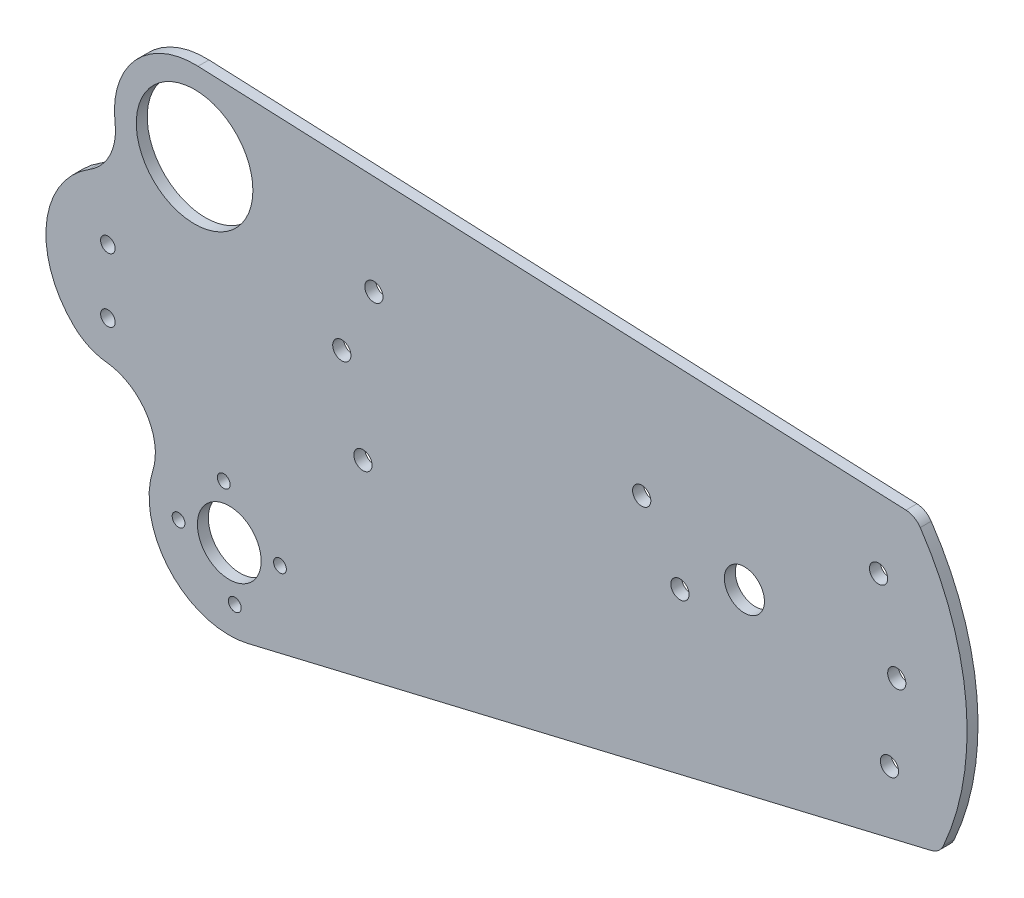
ISO-10303-21;
HEADER;
FILE_DESCRIPTION(('STEP AP214'),'2;1');
FILE_NAME('part.step','',(''),(''),'','','');
FILE_SCHEMA(('AUTOMOTIVE_DESIGN { 1 0 10303 214 1 1 1 1 }'));
ENDSEC;
DATA;
#1=APPLICATION_CONTEXT('core data for automotive mechanical design processes');
#2=APPLICATION_PROTOCOL_DEFINITION('international standard','automotive_design',2000,#1);
#3=PRODUCT_CONTEXT('',#1,'mechanical');
#4=PRODUCT('Part','Part','',(#3));
#5=PRODUCT_RELATED_PRODUCT_CATEGORY('part','',(#4));
#6=PRODUCT_DEFINITION_FORMATION('','',#4);
#7=PRODUCT_DEFINITION_CONTEXT('part definition',#1,'design');
#8=PRODUCT_DEFINITION('design','',#6,#7);
#9=PRODUCT_DEFINITION_SHAPE('','',#8);
#10=(LENGTH_UNIT() NAMED_UNIT(*) SI_UNIT(.MILLI.,.METRE.));
#11=(NAMED_UNIT(*) PLANE_ANGLE_UNIT() SI_UNIT($,.RADIAN.));
#12=(NAMED_UNIT(*) SI_UNIT($,.STERADIAN.) SOLID_ANGLE_UNIT());
#13=UNCERTAINTY_MEASURE_WITH_UNIT(LENGTH_MEASURE(1.E-05),#10,'distance_accuracy_value','');
#14=(GEOMETRIC_REPRESENTATION_CONTEXT(3) GLOBAL_UNCERTAINTY_ASSIGNED_CONTEXT((#13)) GLOBAL_UNIT_ASSIGNED_CONTEXT((#10,
#11,#12)) REPRESENTATION_CONTEXT('',''));
#15=CARTESIAN_POINT('',(0.,0.,0.));
#16=DIRECTION('',(0.,0.,1.));
#17=DIRECTION('',(1.,0.,0.));
#18=AXIS2_PLACEMENT_3D('',#15,#16,#17);
#19=CARTESIAN_POINT('',(1.91215632842237,44.5201547339827,3.));
#20=DIRECTION('',(0.0429107910239942,0.999078907801428,0.));
#21=DIRECTION('',(-0.999078907801428,0.0429107910239942,0.));
#22=AXIS2_PLACEMENT_3D('',#19,#20,#21);
#23=PLANE('',#22);
#24=DIRECTION('',(0.999078907801428,-0.0429107910239942,0.));
#25=VECTOR('',#24,1.);
#26=CARTESIAN_POINT('',(1.91215632842237,44.5201547339827,0.));
#27=LINE('',#26,#25);
#28=CARTESIAN_POINT('',(-113.560266524185,49.4797359716314,0.));
#29=VERTEX_POINT('',#28);
#30=CARTESIAN_POINT('',(80.7215881233943,41.1352618771054,0.));
#31=VERTEX_POINT('',#30);
#32=EDGE_CURVE('E195',#29,#31,#27,.T.);
#33=ORIENTED_EDGE('',*,*,#32,.F.);
#34=DIRECTION('',(0.,0.,-1.));
#35=VECTOR('',#34,1.);
#36=CARTESIAN_POINT('',(-113.560266524185,49.4797359716314,3.));
#37=LINE('',#36,#35);
#38=CARTESIAN_POINT('',(-113.560266524185,49.4797359716314,3.));
#39=VERTEX_POINT('',#38);
#40=EDGE_CURVE('E11',#39,#29,#37,.T.);
#41=ORIENTED_EDGE('',*,*,#40,.F.);
#42=DIRECTION('',(0.999078907801428,-0.0429107910239942,0.));
#43=VECTOR('',#42,1.);
#44=CARTESIAN_POINT('',(1.91215632842237,44.5201547339827,3.));
#45=LINE('',#44,#43);
#46=CARTESIAN_POINT('',(80.7215881233943,41.1352618771054,3.));
#47=VERTEX_POINT('',#46);
#48=EDGE_CURVE('E423',#39,#47,#45,.T.);
#49=ORIENTED_EDGE('',*,*,#48,.T.);
#50=DIRECTION('',(0.,0.,-1.));
#51=VECTOR('',#50,1.);
#52=CARTESIAN_POINT('',(80.7215881233943,41.1352618771054,3.));
#53=LINE('',#52,#51);
#54=EDGE_CURVE('E102',#47,#31,#53,.T.);
#55=ORIENTED_EDGE('',*,*,#54,.T.);
#56=EDGE_LOOP('',(#33,#41,#49,#55));
#57=FACE_BOUND('',#56,.T.);
#58=ADVANCED_FACE('F41',(#57),#23,.T.);
#59=CARTESIAN_POINT('',(-114.504303926713,27.5,3.));
#60=DIRECTION('',(0.,0.,-1.));
#61=DIRECTION('',(-1.,0.,0.));
#62=AXIS2_PLACEMENT_3D('',#59,#60,#61);
#63=CYLINDRICAL_SURFACE('',#62,22.);
#64=CARTESIAN_POINT('',(-114.504303926713,27.5,0.));
#65=DIRECTION('',(0.,0.,1.));
#66=DIRECTION('',(1.,0.,0.));
#67=AXIS2_PLACEMENT_3D('',#64,#65,#66);
#68=CIRCLE('',#67,22.);
#69=CARTESIAN_POINT('',(-136.329525130672,24.732380192604,0.));
#70=VERTEX_POINT('',#69);
#71=EDGE_CURVE('E192',#29,#70,#68,.T.);
#72=ORIENTED_EDGE('',*,*,#71,.T.);
#73=DIRECTION('',(0.,0.,-1.));
#74=VECTOR('',#73,1.);
#75=CARTESIAN_POINT('',(-136.329525130672,24.732380192604,3.));
#76=LINE('',#75,#74);
#77=CARTESIAN_POINT('',(-136.329525130672,24.732380192604,3.));
#78=VERTEX_POINT('',#77);
#79=EDGE_CURVE('E51',#78,#70,#76,.T.);
#80=ORIENTED_EDGE('',*,*,#79,.F.);
#81=CARTESIAN_POINT('',(-114.504303926713,27.5,3.));
#82=DIRECTION('',(0.,0.,1.));
#83=DIRECTION('',(1.,0.,0.));
#84=AXIS2_PLACEMENT_3D('',#81,#82,#83);
#85=CIRCLE('',#84,22.);
#86=EDGE_CURVE('E426',#39,#78,#85,.T.);
#87=ORIENTED_EDGE('',*,*,#86,.F.);
#88=ORIENTED_EDGE('',*,*,#40,.T.);
#89=EDGE_LOOP('',(#72,#80,#87,#88));
#90=FACE_BOUND('',#89,.T.);
#91=ADVANCED_FACE('F193',(#90),#63,.T.);
#92=CARTESIAN_POINT('',(-151.210357769734,22.8453666875613,3.));
#93=DIRECTION('',(0.,0.,-1.));
#94=DIRECTION('',(-1.,0.,0.));
#95=AXIS2_PLACEMENT_3D('',#92,#93,#94);
#96=CYLINDRICAL_SURFACE('',#95,15.);
#97=CARTESIAN_POINT('',(-151.210357769734,22.8453666875613,0.));
#98=DIRECTION('',(0.,0.,1.));
#99=DIRECTION('',(1.,0.,0.));
#100=AXIS2_PLACEMENT_3D('',#97,#98,#99);
#101=CIRCLE('',#100,15.);
#102=CARTESIAN_POINT('',(-143.370984404331,10.0569256082972,0.));
#103=VERTEX_POINT('',#102);
#104=EDGE_CURVE('E187',#103,#70,#101,.T.);
#105=ORIENTED_EDGE('',*,*,#104,.F.);
#106=DIRECTION('',(0.,0.,-1.));
#107=VECTOR('',#106,1.);
#108=CARTESIAN_POINT('',(-143.370984404331,10.0569256082972,3.));
#109=LINE('',#108,#107);
#110=CARTESIAN_POINT('',(-143.370984404331,10.0569256082972,3.));
#111=VERTEX_POINT('',#110);
#112=EDGE_CURVE('E177',#111,#103,#109,.T.);
#113=ORIENTED_EDGE('',*,*,#112,.F.);
#114=CARTESIAN_POINT('',(-151.210357769734,22.8453666875613,3.));
#115=DIRECTION('',(0.,0.,1.));
#116=DIRECTION('',(1.,0.,0.));
#117=AXIS2_PLACEMENT_3D('',#114,#115,#116);
#118=CIRCLE('',#117,15.);
#119=EDGE_CURVE('E189',#111,#78,#118,.T.);
#120=ORIENTED_EDGE('',*,*,#119,.T.);
#121=ORIENTED_EDGE('',*,*,#79,.T.);
#122=EDGE_LOOP('',(#105,#113,#120,#121));
#123=FACE_BOUND('',#122,.T.);
#124=ADVANCED_FACE('F185',(#123),#96,.F.);
#125=CARTESIAN_POINT('',(-130.305362128659,-11.2571428571429,3.));
#126=DIRECTION('',(0.,0.,-1.));
#127=DIRECTION('',(-1.,0.,0.));
#128=AXIS2_PLACEMENT_3D('',#125,#126,#127);
#129=CYLINDRICAL_SURFACE('',#128,25.);
#130=CARTESIAN_POINT('',(-130.305362128659,-11.2571428571429,0.));
#131=DIRECTION('',(0.,0.,1.));
#132=DIRECTION('',(1.,0.,0.));
#133=AXIS2_PLACEMENT_3D('',#130,#131,#132);
#134=CIRCLE('',#133,25.);
#135=CARTESIAN_POINT('',(-147.542861296201,-29.3642857142857,0.));
#136=VERTEX_POINT('',#135);
#137=EDGE_CURVE('E201',#103,#136,#134,.T.);
#138=ORIENTED_EDGE('',*,*,#137,.T.);
#139=DIRECTION('',(0.,0.,-1.));
#140=VECTOR('',#139,1.);
#141=CARTESIAN_POINT('',(-147.542861296201,-29.3642857142857,3.));
#142=LINE('',#141,#140);
#143=CARTESIAN_POINT('',(-147.542861296201,-29.3642857142857,3.));
#144=VERTEX_POINT('',#143);
#145=EDGE_CURVE('E173',#144,#136,#142,.T.);
#146=ORIENTED_EDGE('',*,*,#145,.F.);
#147=CARTESIAN_POINT('',(-130.305362128659,-11.2571428571429,3.));
#148=DIRECTION('',(0.,0.,1.));
#149=DIRECTION('',(1.,0.,0.));
#150=AXIS2_PLACEMENT_3D('',#147,#148,#149);
#151=CIRCLE('',#150,25.);
#152=EDGE_CURVE('E433',#111,#144,#151,.T.);
#153=ORIENTED_EDGE('',*,*,#152,.F.);
#154=ORIENTED_EDGE('',*,*,#112,.T.);
#155=EDGE_LOOP('',(#138,#146,#153,#154));
#156=FACE_BOUND('',#155,.T.);
#157=ADVANCED_FACE('F321',(#156),#129,.T.);
#158=CARTESIAN_POINT('',(-137.200361795676,-18.5,3.));
#159=DIRECTION('',(0.,0.,-1.));
#160=DIRECTION('',(-1.,0.,0.));
#161=AXIS2_PLACEMENT_3D('',#158,#159,#160);
#162=CYLINDRICAL_SURFACE('',#161,15.);
#163=CARTESIAN_POINT('',(-137.200361795676,-18.5,0.));
#164=DIRECTION('',(0.,0.,1.));
#165=DIRECTION('',(1.,0.,0.));
#166=AXIS2_PLACEMENT_3D('',#163,#164,#165);
#167=CIRCLE('',#166,15.);
#168=CARTESIAN_POINT('',(-138.735140925498,-33.4212751808505,0.));
#169=VERTEX_POINT('',#168);
#170=EDGE_CURVE('E205',#136,#169,#167,.T.);
#171=ORIENTED_EDGE('',*,*,#170,.T.);
#172=DIRECTION('',(0.,0.,-1.));
#173=VECTOR('',#172,1.);
#174=CARTESIAN_POINT('',(-138.735140925498,-33.4212751808505,3.));
#175=LINE('',#174,#173);
#176=CARTESIAN_POINT('',(-138.735140925498,-33.4212751808505,3.));
#177=VERTEX_POINT('',#176);
#178=EDGE_CURVE('E170',#177,#169,#175,.T.);
#179=ORIENTED_EDGE('',*,*,#178,.F.);
#180=CARTESIAN_POINT('',(-137.200361795676,-18.5,3.));
#181=DIRECTION('',(0.,0.,1.));
#182=DIRECTION('',(1.,0.,0.));
#183=AXIS2_PLACEMENT_3D('',#180,#181,#182);
#184=CIRCLE('',#183,15.);
#185=EDGE_CURVE('E437',#144,#177,#184,.T.);
#186=ORIENTED_EDGE('',*,*,#185,.F.);
#187=ORIENTED_EDGE('',*,*,#145,.T.);
#188=EDGE_LOOP('',(#171,#179,#186,#187));
#189=FACE_BOUND('',#188,.T.);
#190=ADVANCED_FACE('F324',(#189),#162,.T.);
#191=CARTESIAN_POINT('',(-140.26992005532,-48.3425503617009,3.));
#192=DIRECTION('',(0.,0.,-1.));
#193=DIRECTION('',(-1.,0.,0.));
#194=AXIS2_PLACEMENT_3D('',#191,#192,#193);
#195=CYLINDRICAL_SURFACE('',#194,15.);
#196=CARTESIAN_POINT('',(-140.26992005532,-48.3425503617009,0.));
#197=DIRECTION('',(0.,0.,1.));
#198=DIRECTION('',(1.,0.,0.));
#199=AXIS2_PLACEMENT_3D('',#196,#197,#198);
#200=CIRCLE('',#199,15.);
#201=CARTESIAN_POINT('',(-125.965715233565,-52.8580486085475,0.));
#202=VERTEX_POINT('',#201);
#203=EDGE_CURVE('E212',#202,#169,#200,.T.);
#204=ORIENTED_EDGE('',*,*,#203,.F.);
#205=DIRECTION('',(0.,0.,-1.));
#206=VECTOR('',#205,1.);
#207=CARTESIAN_POINT('',(-125.965715233565,-52.8580486085475,3.));
#208=LINE('',#207,#206);
#209=CARTESIAN_POINT('',(-125.965715233565,-52.8580486085475,3.));
#210=VERTEX_POINT('',#209);
#211=EDGE_CURVE('E167',#210,#202,#208,.T.);
#212=ORIENTED_EDGE('',*,*,#211,.F.);
#213=CARTESIAN_POINT('',(-140.26992005532,-48.3425503617009,3.));
#214=DIRECTION('',(0.,0.,1.));
#215=DIRECTION('',(1.,0.,0.));
#216=AXIS2_PLACEMENT_3D('',#213,#214,#215);
#217=CIRCLE('',#216,15.);
#218=EDGE_CURVE('E440',#210,#177,#217,.T.);
#219=ORIENTED_EDGE('',*,*,#218,.T.);
#220=ORIENTED_EDGE('',*,*,#178,.T.);
#221=EDGE_LOOP('',(#204,#212,#219,#220));
#222=FACE_BOUND('',#221,.T.);
#223=ADVANCED_FACE('F328',(#222),#195,.F.);
#224=CARTESIAN_POINT('',(-104.986214828324,-59.4807793705892,3.));
#225=DIRECTION('',(0.,0.,-1.));
#226=DIRECTION('',(-1.,0.,0.));
#227=AXIS2_PLACEMENT_3D('',#224,#225,#226);
#228=CYLINDRICAL_SURFACE('',#227,22.);
#229=CARTESIAN_POINT('',(-104.986214828324,-59.4807793705892,0.));
#230=DIRECTION('',(0.,0.,1.));
#231=DIRECTION('',(1.,0.,0.));
#232=AXIS2_PLACEMENT_3D('',#229,#230,#231);
#233=CIRCLE('',#232,22.);
#234=CARTESIAN_POINT('',(-99.8994420943231,-80.8846281635664,0.));
#235=VERTEX_POINT('',#234);
#236=EDGE_CURVE('E216',#202,#235,#233,.T.);
#237=ORIENTED_EDGE('',*,*,#236,.T.);
#238=DIRECTION('',(0.,0.,-1.));
#239=VECTOR('',#238,1.);
#240=CARTESIAN_POINT('',(-99.8994420943231,-80.8846281635664,3.));
#241=LINE('',#240,#239);
#242=CARTESIAN_POINT('',(-99.8994420943231,-80.8846281635664,3.));
#243=VERTEX_POINT('',#242);
#244=EDGE_CURVE('E159',#243,#235,#241,.T.);
#245=ORIENTED_EDGE('',*,*,#244,.F.);
#246=CARTESIAN_POINT('',(-104.986214828324,-59.4807793705892,3.));
#247=DIRECTION('',(0.,0.,1.));
#248=DIRECTION('',(1.,0.,0.));
#249=AXIS2_PLACEMENT_3D('',#246,#247,#248);
#250=CIRCLE('',#249,22.);
#251=EDGE_CURVE('E444',#210,#243,#250,.T.);
#252=ORIENTED_EDGE('',*,*,#251,.F.);
#253=ORIENTED_EDGE('',*,*,#211,.T.);
#254=EDGE_LOOP('',(#237,#245,#252,#253));
#255=FACE_BOUND('',#254,.T.);
#256=ADVANCED_FACE('F332',(#255),#228,.T.);
#257=CARTESIAN_POINT('',(12.8543650069219,-54.0879058934321,3.));
#258=DIRECTION('',(-0.231216942454566,0.972902217862598,0.));
#259=DIRECTION('',(-0.972902217862598,-0.231216942454566,0.));
#260=AXIS2_PLACEMENT_3D('',#257,#258,#259);
#261=PLANE('',#260);
#262=DIRECTION('',(0.972902217862598,0.231216942454566,0.));
#263=VECTOR('',#262,1.);
#264=CARTESIAN_POINT('',(12.8543650069219,-54.0879058934321,0.));
#265=LINE('',#264,#263);
#266=CARTESIAN_POINT('',(87.5903381718725,-36.3263848594582,0.));
#267=VERTEX_POINT('',#266);
#268=EDGE_CURVE('E220',#235,#267,#265,.T.);
#269=ORIENTED_EDGE('',*,*,#268,.T.);
#270=DIRECTION('',(0.,0.,-1.));
#271=VECTOR('',#270,1.);
#272=CARTESIAN_POINT('',(87.5903381718725,-36.3263848594582,3.));
#273=LINE('',#272,#271);
#274=CARTESIAN_POINT('',(87.5903381718725,-36.3263848594582,3.));
#275=VERTEX_POINT('',#274);
#276=EDGE_CURVE('E155',#275,#267,#273,.T.);
#277=ORIENTED_EDGE('',*,*,#276,.F.);
#278=DIRECTION('',(0.972902217862598,0.231216942454566,0.));
#279=VECTOR('',#278,1.);
#280=CARTESIAN_POINT('',(12.8543650069219,-54.0879058934321,3.));
#281=LINE('',#280,#279);
#282=EDGE_CURVE('E146',#243,#275,#281,.T.);
#283=ORIENTED_EDGE('',*,*,#282,.F.);
#284=ORIENTED_EDGE('',*,*,#244,.T.);
#285=EDGE_LOOP('',(#269,#277,#283,#284));
#286=FACE_BOUND('',#285,.T.);
#287=ADVANCED_FACE('F336',(#286),#261,.F.);
#288=CARTESIAN_POINT('',(86.4342534595996,-31.4618737701452,3.));
#289=DIRECTION('',(0.,0.,-1.));
#290=DIRECTION('',(-1.,0.,0.));
#291=AXIS2_PLACEMENT_3D('',#288,#289,#290);
#292=CYLINDRICAL_SURFACE('',#291,5.00000000000001);
#293=CARTESIAN_POINT('',(86.4342534595996,-31.4618737701452,0.));
#294=DIRECTION('',(0.,0.,1.));
#295=DIRECTION('',(1.,0.,0.));
#296=AXIS2_PLACEMENT_3D('',#293,#294,#295);
#297=CIRCLE('',#296,5.00000000000001);
#298=CARTESIAN_POINT('',(91.,-33.5,0.));
#299=VERTEX_POINT('',#298);
#300=EDGE_CURVE('E153',#267,#299,#297,.T.);
#301=ORIENTED_EDGE('',*,*,#300,.T.);
#302=DIRECTION('',(0.,0.,-1.));
#303=VECTOR('',#302,1.);
#304=CARTESIAN_POINT('',(91.,-33.5,3.));
#305=LINE('',#304,#303);
#306=CARTESIAN_POINT('',(91.,-33.5,3.));
#307=VERTEX_POINT('',#306);
#308=EDGE_CURVE('E136',#307,#299,#305,.T.);
#309=ORIENTED_EDGE('',*,*,#308,.F.);
#310=CARTESIAN_POINT('',(86.4342534595996,-31.4618737701452,3.));
#311=DIRECTION('',(0.,0.,1.));
#312=DIRECTION('',(1.,0.,0.));
#313=AXIS2_PLACEMENT_3D('',#310,#311,#312);
#314=CIRCLE('',#313,5.00000000000001);
#315=EDGE_CURVE('E140',#275,#307,#314,.T.);
#316=ORIENTED_EDGE('',*,*,#315,.F.);
#317=ORIENTED_EDGE('',*,*,#276,.T.);
#318=EDGE_LOOP('',(#301,#309,#316,#317));
#319=FACE_BOUND('',#318,.T.);
#320=ADVANCED_FACE('F152',(#319),#292,.T.);
#321=CARTESIAN_POINT('',(22.6589151875398,-2.99288439458776,3.));
#322=DIRECTION('',(0.,0.,-1.));
#323=DIRECTION('',(-1.,0.,0.));
#324=AXIS2_PLACEMENT_3D('',#321,#322,#323);
#325=CYLINDRICAL_SURFACE('',#324,74.8410848124603);
#326=CARTESIAN_POINT('',(22.6589151875398,-2.99288439458776,0.));
#327=DIRECTION('',(0.,0.,1.));
#328=DIRECTION('',(1.,0.,0.));
#329=AXIS2_PLACEMENT_3D('',#326,#327,#328);
#330=CIRCLE('',#329,74.8410848124603);
#331=CARTESIAN_POINT('',(84.648444567044,38.9414240319674,0.));
#332=VERTEX_POINT('',#331);
#333=EDGE_CURVE('E226',#299,#332,#330,.T.);
#334=ORIENTED_EDGE('',*,*,#333,.T.);
#335=DIRECTION('',(0.,0.,-1.));
#336=VECTOR('',#335,1.);
#337=CARTESIAN_POINT('',(84.648444567044,38.9414240319674,3.));
#338=LINE('',#337,#336);
#339=CARTESIAN_POINT('',(84.648444567044,38.9414240319674,3.));
#340=VERTEX_POINT('',#339);
#341=EDGE_CURVE('E138',#340,#332,#338,.T.);
#342=ORIENTED_EDGE('',*,*,#341,.F.);
#343=CARTESIAN_POINT('',(22.6589151875398,-2.99288439458776,3.));
#344=DIRECTION('',(0.,0.,1.));
#345=DIRECTION('',(1.,0.,0.));
#346=AXIS2_PLACEMENT_3D('',#343,#344,#345);
#347=CIRCLE('',#346,74.8410848124603);
#348=EDGE_CURVE('E131',#307,#340,#347,.T.);
#349=ORIENTED_EDGE('',*,*,#348,.F.);
#350=ORIENTED_EDGE('',*,*,#308,.T.);
#351=EDGE_LOOP('',(#334,#342,#349,#350));
#352=FACE_BOUND('',#351,.T.);
#353=ADVANCED_FACE('F134',(#352),#325,.T.);
#354=CARTESIAN_POINT('',(-103.463320572581,-73.3977040698835,3.));
#355=DIRECTION('',(0.,0.,-1.));
#356=DIRECTION('',(-1.,0.,0.));
#357=AXIS2_PLACEMENT_3D('',#354,#355,#356);
#358=CYLINDRICAL_SURFACE('',#357,1.75);
#359=CARTESIAN_POINT('',(-103.463320572581,-73.3977040698835,3.));
#360=DIRECTION('',(0.,0.,1.));
#361=DIRECTION('',(1.,0.,0.));
#362=AXIS2_PLACEMENT_3D('',#359,#360,#361);
#363=CIRCLE('',#362,1.75);
#364=CARTESIAN_POINT('',(-101.713320572581,-73.3977040698835,3.));
#365=VERTEX_POINT('',#364);
#366=EDGE_CURVE('E299',#365,#365,#363,.T.);
#367=ORIENTED_EDGE('',*,*,#366,.T.);
#368=EDGE_LOOP('',(#367));
#369=FACE_BOUND('',#368,.T.);
#370=CARTESIAN_POINT('',(-103.463320572581,-73.3977040698835,0.));
#371=DIRECTION('',(0.,0.,1.));
#372=DIRECTION('',(1.,0.,0.));
#373=AXIS2_PLACEMENT_3D('',#370,#371,#372);
#374=CIRCLE('',#373,1.75);
#375=CARTESIAN_POINT('',(-101.713320572581,-73.3977040698835,0.));
#376=VERTEX_POINT('',#375);
#377=EDGE_CURVE('E287',#376,#376,#374,.T.);
#378=ORIENTED_EDGE('',*,*,#377,.F.);
#379=EDGE_LOOP('',(#378));
#380=FACE_BOUND('',#379,.T.);
#381=ADVANCED_FACE('F345',(#369,#380),#358,.F.);
#382=CARTESIAN_POINT('',(-91.0692901290293,-57.9578851148469,3.));
#383=DIRECTION('',(0.,0.,-1.));
#384=DIRECTION('',(-1.,0.,0.));
#385=AXIS2_PLACEMENT_3D('',#382,#383,#384);
#386=CYLINDRICAL_SURFACE('',#385,1.74999999999997);
#387=CARTESIAN_POINT('',(-91.0692901290293,-57.9578851148469,3.));
#388=DIRECTION('',(0.,0.,1.));
#389=DIRECTION('',(1.,0.,0.));
#390=AXIS2_PLACEMENT_3D('',#387,#388,#389);
#391=CIRCLE('',#390,1.74999999999997);
#392=CARTESIAN_POINT('',(-89.3192901290293,-57.9578851148469,3.));
#393=VERTEX_POINT('',#392);
#394=EDGE_CURVE('E305',#393,#393,#391,.T.);
#395=ORIENTED_EDGE('',*,*,#394,.T.);
#396=EDGE_LOOP('',(#395));
#397=FACE_BOUND('',#396,.T.);
#398=CARTESIAN_POINT('',(-91.0692901290293,-57.9578851148469,0.));
#399=DIRECTION('',(0.,0.,1.));
#400=DIRECTION('',(1.,0.,0.));
#401=AXIS2_PLACEMENT_3D('',#398,#399,#400);
#402=CIRCLE('',#401,1.74999999999997);
#403=CARTESIAN_POINT('',(-89.3192901290293,-57.9578851148469,0.));
#404=VERTEX_POINT('',#403);
#405=EDGE_CURVE('E283',#404,#404,#402,.T.);
#406=ORIENTED_EDGE('',*,*,#405,.F.);
#407=EDGE_LOOP('',(#406));
#408=FACE_BOUND('',#407,.T.);
#409=ADVANCED_FACE('F401',(#397,#408),#386,.F.);
#410=CARTESIAN_POINT('',(-106.509109084066,-45.5638546712949,3.));
#411=DIRECTION('',(0.,0.,-1.));
#412=DIRECTION('',(-1.,0.,0.));
#413=AXIS2_PLACEMENT_3D('',#410,#411,#412);
#414=CYLINDRICAL_SURFACE('',#413,1.74999999999998);
#415=CARTESIAN_POINT('',(-106.509109084066,-45.5638546712949,3.));
#416=DIRECTION('',(0.,0.,1.));
#417=DIRECTION('',(1.,0.,0.));
#418=AXIS2_PLACEMENT_3D('',#415,#416,#417);
#419=CIRCLE('',#418,1.74999999999998);
#420=CARTESIAN_POINT('',(-104.759109084066,-45.5638546712949,3.));
#421=VERTEX_POINT('',#420);
#422=EDGE_CURVE('E499',#421,#421,#419,.T.);
#423=ORIENTED_EDGE('',*,*,#422,.T.);
#424=EDGE_LOOP('',(#423));
#425=FACE_BOUND('',#424,.T.);
#426=CARTESIAN_POINT('',(-106.509109084066,-45.5638546712949,0.));
#427=DIRECTION('',(0.,0.,1.));
#428=DIRECTION('',(1.,0.,0.));
#429=AXIS2_PLACEMENT_3D('',#426,#427,#428);
#430=CIRCLE('',#429,1.74999999999998);
#431=CARTESIAN_POINT('',(-104.759109084066,-45.5638546712949,0.));
#432=VERTEX_POINT('',#431);
#433=EDGE_CURVE('E279',#432,#432,#430,.T.);
#434=ORIENTED_EDGE('',*,*,#433,.F.);
#435=EDGE_LOOP('',(#434));
#436=FACE_BOUND('',#435,.T.);
#437=ADVANCED_FACE('F397',(#425,#436),#414,.F.);
#438=CARTESIAN_POINT('',(-104.986214828324,-59.4807793705892,3.));
#439=DIRECTION('',(0.,0.,-1.));
#440=DIRECTION('',(-1.,0.,0.));
#441=AXIS2_PLACEMENT_3D('',#438,#439,#440);
#442=CYLINDRICAL_SURFACE('',#441,8.75000000000001);
#443=CARTESIAN_POINT('',(-104.986214828324,-59.4807793705892,3.));
#444=DIRECTION('',(0.,0.,1.));
#445=DIRECTION('',(1.,0.,0.));
#446=AXIS2_PLACEMENT_3D('',#443,#444,#445);
#447=CIRCLE('',#446,8.75000000000001);
#448=CARTESIAN_POINT('',(-96.2362148283235,-59.4807793705892,3.));
#449=VERTEX_POINT('',#448);
#450=EDGE_CURVE('E495',#449,#449,#447,.T.);
#451=ORIENTED_EDGE('',*,*,#450,.T.);
#452=EDGE_LOOP('',(#451));
#453=FACE_BOUND('',#452,.T.);
#454=CARTESIAN_POINT('',(-104.986214828324,-59.4807793705892,0.));
#455=DIRECTION('',(0.,0.,1.));
#456=DIRECTION('',(1.,0.,0.));
#457=AXIS2_PLACEMENT_3D('',#454,#455,#456);
#458=CIRCLE('',#457,8.75000000000001);
#459=CARTESIAN_POINT('',(-96.2362148283235,-59.4807793705892,0.));
#460=VERTEX_POINT('',#459);
#461=EDGE_CURVE('E275',#460,#460,#458,.T.);
#462=ORIENTED_EDGE('',*,*,#461,.F.);
#463=EDGE_LOOP('',(#462));
#464=FACE_BOUND('',#463,.T.);
#465=ADVANCED_FACE('F393',(#453,#464),#442,.F.);
#466=CARTESIAN_POINT('',(-114.504303926713,27.5,3.));
#467=DIRECTION('',(0.,0.,-1.));
#468=DIRECTION('',(-1.,0.,0.));
#469=AXIS2_PLACEMENT_3D('',#466,#467,#468);
#470=CYLINDRICAL_SURFACE('',#469,16.);
#471=CARTESIAN_POINT('',(-114.504303926713,27.5,3.));
#472=DIRECTION('',(0.,0.,1.));
#473=DIRECTION('',(1.,0.,0.));
#474=AXIS2_PLACEMENT_3D('',#471,#472,#473);
#475=CIRCLE('',#474,16.);
#476=CARTESIAN_POINT('',(-98.5043039267133,27.5,3.));
#477=VERTEX_POINT('',#476);
#478=EDGE_CURVE('E491',#477,#477,#475,.T.);
#479=ORIENTED_EDGE('',*,*,#478,.T.);
#480=EDGE_LOOP('',(#479));
#481=FACE_BOUND('',#480,.T.);
#482=CARTESIAN_POINT('',(-114.504303926713,27.5,0.));
#483=DIRECTION('',(0.,0.,1.));
#484=DIRECTION('',(1.,0.,0.));
#485=AXIS2_PLACEMENT_3D('',#482,#483,#484);
#486=CIRCLE('',#485,16.);
#487=CARTESIAN_POINT('',(-98.5043039267133,27.5,0.));
#488=VERTEX_POINT('',#487);
#489=EDGE_CURVE('E271',#488,#488,#486,.T.);
#490=ORIENTED_EDGE('',*,*,#489,.F.);
#491=EDGE_LOOP('',(#490));
#492=FACE_BOUND('',#491,.T.);
#493=ADVANCED_FACE('F389',(#481,#492),#470,.F.);
#494=CARTESIAN_POINT('',(-68.3,-21.5,3.));
#495=DIRECTION('',(0.,0.,-1.));
#496=DIRECTION('',(-1.,0.,0.));
#497=AXIS2_PLACEMENT_3D('',#494,#495,#496);
#498=CYLINDRICAL_SURFACE('',#497,2.49999999999999);
#499=CARTESIAN_POINT('',(-68.3,-21.5,3.));
#500=DIRECTION('',(0.,0.,1.));
#501=DIRECTION('',(1.,0.,0.));
#502=AXIS2_PLACEMENT_3D('',#499,#500,#501);
#503=CIRCLE('',#502,2.49999999999999);
#504=CARTESIAN_POINT('',(-65.8,-21.5,3.));
#505=VERTEX_POINT('',#504);
#506=EDGE_CURVE('E487',#505,#505,#503,.T.);
#507=ORIENTED_EDGE('',*,*,#506,.T.);
#508=EDGE_LOOP('',(#507));
#509=FACE_BOUND('',#508,.T.);
#510=CARTESIAN_POINT('',(-68.3,-21.5,0.));
#511=DIRECTION('',(0.,0.,1.));
#512=DIRECTION('',(1.,0.,0.));
#513=AXIS2_PLACEMENT_3D('',#510,#511,#512);
#514=CIRCLE('',#513,2.49999999999999);
#515=CARTESIAN_POINT('',(-65.8,-21.5,0.));
#516=VERTEX_POINT('',#515);
#517=EDGE_CURVE('E267',#516,#516,#514,.T.);
#518=ORIENTED_EDGE('',*,*,#517,.F.);
#519=EDGE_LOOP('',(#518));
#520=FACE_BOUND('',#519,.T.);
#521=ADVANCED_FACE('F385',(#509,#520),#498,.F.);
#522=CARTESIAN_POINT('',(-138.3,-5.25000000000004,3.));
#523=DIRECTION('',(0.,0.,-1.));
#524=DIRECTION('',(-1.,0.,0.));
#525=AXIS2_PLACEMENT_3D('',#522,#523,#524);
#526=CYLINDRICAL_SURFACE('',#525,2.);
#527=CARTESIAN_POINT('',(-138.3,-5.25000000000004,3.));
#528=DIRECTION('',(0.,0.,1.));
#529=DIRECTION('',(1.,0.,0.));
#530=AXIS2_PLACEMENT_3D('',#527,#528,#529);
#531=CIRCLE('',#530,2.);
#532=CARTESIAN_POINT('',(-136.3,-5.25000000000004,3.));
#533=VERTEX_POINT('',#532);
#534=EDGE_CURVE('E483',#533,#533,#531,.T.);
#535=ORIENTED_EDGE('',*,*,#534,.T.);
#536=EDGE_LOOP('',(#535));
#537=FACE_BOUND('',#536,.T.);
#538=CARTESIAN_POINT('',(-138.3,-5.25000000000004,0.));
#539=DIRECTION('',(0.,0.,1.));
#540=DIRECTION('',(1.,0.,0.));
#541=AXIS2_PLACEMENT_3D('',#538,#539,#540);
#542=CIRCLE('',#541,2.);
#543=CARTESIAN_POINT('',(-136.3,-5.25000000000004,0.));
#544=VERTEX_POINT('',#543);
#545=EDGE_CURVE('E263',#544,#544,#542,.T.);
#546=ORIENTED_EDGE('',*,*,#545,.F.);
#547=EDGE_LOOP('',(#546));
#548=FACE_BOUND('',#547,.T.);
#549=ADVANCED_FACE('F381',(#537,#548),#526,.F.);
#550=CARTESIAN_POINT('',(-138.3,-22.75,3.));
#551=DIRECTION('',(0.,0.,-1.));
#552=DIRECTION('',(-1.,0.,0.));
#553=AXIS2_PLACEMENT_3D('',#550,#551,#552);
#554=CYLINDRICAL_SURFACE('',#553,2.);
#555=CARTESIAN_POINT('',(-138.3,-22.75,3.));
#556=DIRECTION('',(0.,0.,1.));
#557=DIRECTION('',(1.,0.,0.));
#558=AXIS2_PLACEMENT_3D('',#555,#556,#557);
#559=CIRCLE('',#558,2.);
#560=CARTESIAN_POINT('',(-136.3,-22.75,3.));
#561=VERTEX_POINT('',#560);
#562=EDGE_CURVE('E479',#561,#561,#559,.T.);
#563=ORIENTED_EDGE('',*,*,#562,.T.);
#564=EDGE_LOOP('',(#563));
#565=FACE_BOUND('',#564,.T.);
#566=CARTESIAN_POINT('',(-138.3,-22.75,0.));
#567=DIRECTION('',(0.,0.,1.));
#568=DIRECTION('',(1.,0.,0.));
#569=AXIS2_PLACEMENT_3D('',#566,#567,#568);
#570=CIRCLE('',#569,2.);
#571=CARTESIAN_POINT('',(-136.3,-22.75,0.));
#572=VERTEX_POINT('',#571);
#573=EDGE_CURVE('E259',#572,#572,#570,.T.);
#574=ORIENTED_EDGE('',*,*,#573,.F.);
#575=EDGE_LOOP('',(#574));
#576=FACE_BOUND('',#575,.T.);
#577=ADVANCED_FACE('F377',(#565,#576),#554,.F.);
#578=CARTESIAN_POINT('',(-74.1,1.7,3.));
#579=DIRECTION('',(0.,0.,-1.));
#580=DIRECTION('',(-1.,0.,0.));
#581=AXIS2_PLACEMENT_3D('',#578,#579,#580);
#582=CYLINDRICAL_SURFACE('',#581,2.49999999999999);
#583=CARTESIAN_POINT('',(-74.1,1.7,3.));
#584=DIRECTION('',(0.,0.,1.));
#585=DIRECTION('',(1.,0.,0.));
#586=AXIS2_PLACEMENT_3D('',#583,#584,#585);
#587=CIRCLE('',#586,2.49999999999999);
#588=CARTESIAN_POINT('',(-71.6,1.7,3.));
#589=VERTEX_POINT('',#588);
#590=EDGE_CURVE('E475',#589,#589,#587,.T.);
#591=ORIENTED_EDGE('',*,*,#590,.T.);
#592=EDGE_LOOP('',(#591));
#593=FACE_BOUND('',#592,.T.);
#594=CARTESIAN_POINT('',(-74.1,1.7,0.));
#595=DIRECTION('',(0.,0.,1.));
#596=DIRECTION('',(1.,0.,0.));
#597=AXIS2_PLACEMENT_3D('',#594,#595,#596);
#598=CIRCLE('',#597,2.49999999999999);
#599=CARTESIAN_POINT('',(-71.6,1.7,0.));
#600=VERTEX_POINT('',#599);
#601=EDGE_CURVE('E255',#600,#600,#598,.T.);
#602=ORIENTED_EDGE('',*,*,#601,.F.);
#603=EDGE_LOOP('',(#602));
#604=FACE_BOUND('',#603,.T.);
#605=ADVANCED_FACE('F373',(#593,#604),#582,.F.);
#606=CARTESIAN_POINT('',(-65.3,20.,3.));
#607=DIRECTION('',(0.,0.,-1.));
#608=DIRECTION('',(-1.,0.,0.));
#609=AXIS2_PLACEMENT_3D('',#606,#607,#608);
#610=CYLINDRICAL_SURFACE('',#609,2.50000000000001);
#611=CARTESIAN_POINT('',(-65.3,20.,3.));
#612=DIRECTION('',(0.,0.,1.));
#613=DIRECTION('',(1.,0.,0.));
#614=AXIS2_PLACEMENT_3D('',#611,#612,#613);
#615=CIRCLE('',#614,2.50000000000001);
#616=CARTESIAN_POINT('',(-62.8,20.,3.));
#617=VERTEX_POINT('',#616);
#618=EDGE_CURVE('E471',#617,#617,#615,.T.);
#619=ORIENTED_EDGE('',*,*,#618,.T.);
#620=EDGE_LOOP('',(#619));
#621=FACE_BOUND('',#620,.T.);
#622=CARTESIAN_POINT('',(-65.3,20.,0.));
#623=DIRECTION('',(0.,0.,1.));
#624=DIRECTION('',(1.,0.,0.));
#625=AXIS2_PLACEMENT_3D('',#622,#623,#624);
#626=CIRCLE('',#625,2.50000000000001);
#627=CARTESIAN_POINT('',(-62.8,20.,0.));
#628=VERTEX_POINT('',#627);
#629=EDGE_CURVE('E251',#628,#628,#626,.T.);
#630=ORIENTED_EDGE('',*,*,#629,.F.);
#631=EDGE_LOOP('',(#630));
#632=FACE_BOUND('',#631,.T.);
#633=ADVANCED_FACE('F369',(#621,#632),#610,.F.);
#634=CARTESIAN_POINT('',(78.2,-0.100000000000003,3.));
#635=DIRECTION('',(0.,0.,-1.));
#636=DIRECTION('',(-1.,0.,0.));
#637=AXIS2_PLACEMENT_3D('',#634,#635,#636);
#638=CYLINDRICAL_SURFACE('',#637,2.5);
#639=CARTESIAN_POINT('',(78.2,-0.100000000000003,3.));
#640=DIRECTION('',(0.,0.,1.));
#641=DIRECTION('',(1.,0.,0.));
#642=AXIS2_PLACEMENT_3D('',#639,#640,#641);
#643=CIRCLE('',#642,2.5);
#644=CARTESIAN_POINT('',(80.7,-0.100000000000003,3.));
#645=VERTEX_POINT('',#644);
#646=EDGE_CURVE('E467',#645,#645,#643,.T.);
#647=ORIENTED_EDGE('',*,*,#646,.T.);
#648=EDGE_LOOP('',(#647));
#649=FACE_BOUND('',#648,.T.);
#650=CARTESIAN_POINT('',(78.2,-0.100000000000003,0.));
#651=DIRECTION('',(0.,0.,1.));
#652=DIRECTION('',(1.,0.,0.));
#653=AXIS2_PLACEMENT_3D('',#650,#651,#652);
#654=CIRCLE('',#653,2.5);
#655=CARTESIAN_POINT('',(80.7,-0.100000000000003,0.));
#656=VERTEX_POINT('',#655);
#657=EDGE_CURVE('E247',#656,#656,#654,.T.);
#658=ORIENTED_EDGE('',*,*,#657,.F.);
#659=EDGE_LOOP('',(#658));
#660=FACE_BOUND('',#659,.T.);
#661=ADVANCED_FACE('F365',(#649,#660),#638,.F.);
#662=CARTESIAN_POINT('',(18.7,-8.7,3.));
#663=DIRECTION('',(0.,0.,-1.));
#664=DIRECTION('',(-1.,0.,0.));
#665=AXIS2_PLACEMENT_3D('',#662,#663,#664);
#666=CYLINDRICAL_SURFACE('',#665,2.5);
#667=CARTESIAN_POINT('',(18.7,-8.7,3.));
#668=DIRECTION('',(0.,0.,1.));
#669=DIRECTION('',(1.,0.,0.));
#670=AXIS2_PLACEMENT_3D('',#667,#668,#669);
#671=CIRCLE('',#670,2.5);
#672=CARTESIAN_POINT('',(21.2,-8.7,3.));
#673=VERTEX_POINT('',#672);
#674=EDGE_CURVE('E463',#673,#673,#671,.T.);
#675=ORIENTED_EDGE('',*,*,#674,.T.);
#676=EDGE_LOOP('',(#675));
#677=FACE_BOUND('',#676,.T.);
#678=CARTESIAN_POINT('',(18.7,-8.7,0.));
#679=DIRECTION('',(0.,0.,1.));
#680=DIRECTION('',(1.,0.,0.));
#681=AXIS2_PLACEMENT_3D('',#678,#679,#680);
#682=CIRCLE('',#681,2.5);
#683=CARTESIAN_POINT('',(21.2,-8.7,0.));
#684=VERTEX_POINT('',#683);
#685=EDGE_CURVE('E243',#684,#684,#682,.T.);
#686=ORIENTED_EDGE('',*,*,#685,.F.);
#687=EDGE_LOOP('',(#686));
#688=FACE_BOUND('',#687,.T.);
#689=ADVANCED_FACE('F361',(#677,#688),#666,.F.);
#690=CARTESIAN_POINT('',(8.20000000000003,8.3,3.));
#691=DIRECTION('',(0.,0.,-1.));
#692=DIRECTION('',(-1.,0.,0.));
#693=AXIS2_PLACEMENT_3D('',#690,#691,#692);
#694=CYLINDRICAL_SURFACE('',#693,2.5);
#695=CARTESIAN_POINT('',(8.20000000000003,8.3,3.));
#696=DIRECTION('',(0.,0.,1.));
#697=DIRECTION('',(1.,0.,0.));
#698=AXIS2_PLACEMENT_3D('',#695,#696,#697);
#699=CIRCLE('',#698,2.5);
#700=CARTESIAN_POINT('',(10.7,8.3,3.));
#701=VERTEX_POINT('',#700);
#702=EDGE_CURVE('E459',#701,#701,#699,.T.);
#703=ORIENTED_EDGE('',*,*,#702,.T.);
#704=EDGE_LOOP('',(#703));
#705=FACE_BOUND('',#704,.T.);
#706=CARTESIAN_POINT('',(8.20000000000003,8.3,0.));
#707=DIRECTION('',(0.,0.,1.));
#708=DIRECTION('',(1.,0.,0.));
#709=AXIS2_PLACEMENT_3D('',#706,#707,#708);
#710=CIRCLE('',#709,2.5);
#711=CARTESIAN_POINT('',(10.7,8.3,0.));
#712=VERTEX_POINT('',#711);
#713=EDGE_CURVE('E239',#712,#712,#710,.T.);
#714=ORIENTED_EDGE('',*,*,#713,.F.);
#715=EDGE_LOOP('',(#714));
#716=FACE_BOUND('',#715,.T.);
#717=ADVANCED_FACE('F357',(#705,#716),#694,.F.);
#718=CARTESIAN_POINT('',(36.3824499650715,0.,3.));
#719=DIRECTION('',(0.,0.,-1.));
#720=DIRECTION('',(-1.,0.,0.));
#721=AXIS2_PLACEMENT_3D('',#718,#719,#720);
#722=CYLINDRICAL_SURFACE('',#721,5.5);
#723=CARTESIAN_POINT('',(36.3824499650715,0.,3.));
#724=DIRECTION('',(0.,0.,1.));
#725=DIRECTION('',(1.,0.,0.));
#726=AXIS2_PLACEMENT_3D('',#723,#724,#725);
#727=CIRCLE('',#726,5.5);
#728=CARTESIAN_POINT('',(41.8824499650715,0.,3.));
#729=VERTEX_POINT('',#728);
#730=EDGE_CURVE('E455',#729,#729,#727,.T.);
#731=ORIENTED_EDGE('',*,*,#730,.T.);
#732=EDGE_LOOP('',(#731));
#733=FACE_BOUND('',#732,.T.);
#734=CARTESIAN_POINT('',(36.3824499650715,0.,0.));
#735=DIRECTION('',(0.,0.,1.));
#736=DIRECTION('',(1.,0.,0.));
#737=AXIS2_PLACEMENT_3D('',#734,#735,#736);
#738=CIRCLE('',#737,5.5);
#739=CARTESIAN_POINT('',(41.8824499650715,0.,0.));
#740=VERTEX_POINT('',#739);
#741=EDGE_CURVE('E235',#740,#740,#738,.T.);
#742=ORIENTED_EDGE('',*,*,#741,.F.);
#743=EDGE_LOOP('',(#742));
#744=FACE_BOUND('',#743,.T.);
#745=ADVANCED_FACE('F353',(#733,#744),#722,.F.);
#746=CARTESIAN_POINT('',(76.2,-22.,3.));
#747=DIRECTION('',(0.,0.,-1.));
#748=DIRECTION('',(-1.,0.,0.));
#749=AXIS2_PLACEMENT_3D('',#746,#747,#748);
#750=CYLINDRICAL_SURFACE('',#749,2.5);
#751=CARTESIAN_POINT('',(76.2,-22.,3.));
#752=DIRECTION('',(0.,0.,1.));
#753=DIRECTION('',(1.,0.,0.));
#754=AXIS2_PLACEMENT_3D('',#751,#752,#753);
#755=CIRCLE('',#754,2.5);
#756=CARTESIAN_POINT('',(78.7,-22.,3.));
#757=VERTEX_POINT('',#756);
#758=EDGE_CURVE('E451',#757,#757,#755,.T.);
#759=ORIENTED_EDGE('',*,*,#758,.T.);
#760=EDGE_LOOP('',(#759));
#761=FACE_BOUND('',#760,.T.);
#762=CARTESIAN_POINT('',(76.2,-22.,0.));
#763=DIRECTION('',(0.,0.,1.));
#764=DIRECTION('',(1.,0.,0.));
#765=AXIS2_PLACEMENT_3D('',#762,#763,#764);
#766=CIRCLE('',#765,2.5);
#767=CARTESIAN_POINT('',(78.7,-22.,0.));
#768=VERTEX_POINT('',#767);
#769=EDGE_CURVE('E231',#768,#768,#766,.T.);
#770=ORIENTED_EDGE('',*,*,#769,.F.);
#771=EDGE_LOOP('',(#770));
#772=FACE_BOUND('',#771,.T.);
#773=ADVANCED_FACE('F349',(#761,#772),#750,.F.);
#774=CARTESIAN_POINT('',(80.5070341682744,36.1398673380983,3.));
#775=DIRECTION('',(0.,0.,-1.));
#776=DIRECTION('',(-1.,0.,0.));
#777=AXIS2_PLACEMENT_3D('',#774,#775,#776);
#778=CYLINDRICAL_SURFACE('',#777,5.00000000000002);
#779=CARTESIAN_POINT('',(80.5070341682744,36.1398673380983,0.));
#780=DIRECTION('',(0.,0.,1.));
#781=DIRECTION('',(1.,0.,0.));
#782=AXIS2_PLACEMENT_3D('',#779,#780,#781);
#783=CIRCLE('',#782,5.00000000000002);
#784=EDGE_CURVE('E95',#332,#31,#783,.T.);
#785=ORIENTED_EDGE('',*,*,#784,.T.);
#786=ORIENTED_EDGE('',*,*,#54,.F.);
#787=CARTESIAN_POINT('',(80.5070341682744,36.1398673380983,3.));
#788=DIRECTION('',(0.,0.,1.));
#789=DIRECTION('',(1.,0.,0.));
#790=AXIS2_PLACEMENT_3D('',#787,#788,#789);
#791=CIRCLE('',#790,5.00000000000002);
#792=EDGE_CURVE('E59',#340,#47,#791,.T.);
#793=ORIENTED_EDGE('',*,*,#792,.F.);
#794=ORIENTED_EDGE('',*,*,#341,.T.);
#795=EDGE_LOOP('',(#785,#786,#793,#794));
#796=FACE_BOUND('',#795,.T.);
#797=ADVANCED_FACE('F346',(#796),#778,.T.);
#798=CARTESIAN_POINT('',(73.2,22.3,3.));
#799=DIRECTION('',(0.,0.,-1.));
#800=DIRECTION('',(-1.,0.,0.));
#801=AXIS2_PLACEMENT_3D('',#798,#799,#800);
#802=CYLINDRICAL_SURFACE('',#801,2.50000000000001);
#803=CARTESIAN_POINT('',(73.2,22.3,3.));
#804=DIRECTION('',(0.,0.,1.));
#805=DIRECTION('',(1.,0.,0.));
#806=AXIS2_PLACEMENT_3D('',#803,#804,#805);
#807=CIRCLE('',#806,2.50000000000001);
#808=CARTESIAN_POINT('',(75.7000000000001,22.3,3.));
#809=VERTEX_POINT('',#808);
#810=EDGE_CURVE('E294',#809,#809,#807,.T.);
#811=ORIENTED_EDGE('',*,*,#810,.T.);
#812=EDGE_LOOP('',(#811));
#813=FACE_BOUND('',#812,.T.);
#814=CARTESIAN_POINT('',(73.2,22.3,0.));
#815=DIRECTION('',(0.,0.,1.));
#816=DIRECTION('',(1.,0.,0.));
#817=AXIS2_PLACEMENT_3D('',#814,#815,#816);
#818=CIRCLE('',#817,2.50000000000001);
#819=CARTESIAN_POINT('',(75.7000000000001,22.3,0.));
#820=VERTEX_POINT('',#819);
#821=EDGE_CURVE('E309',#820,#820,#818,.T.);
#822=ORIENTED_EDGE('',*,*,#821,.F.);
#823=EDGE_LOOP('',(#822));
#824=FACE_BOUND('',#823,.T.);
#825=ADVANCED_FACE('F43',(#813,#824),#802,.F.);
#826=CARTESIAN_POINT('',(-118.903139527618,-61.0036736263316,3.));
#827=DIRECTION('',(0.,0.,-1.));
#828=DIRECTION('',(-1.,0.,0.));
#829=AXIS2_PLACEMENT_3D('',#826,#827,#828);
#830=CYLINDRICAL_SURFACE('',#829,1.75000000000001);
#831=CARTESIAN_POINT('',(-118.903139527618,-61.0036736263316,3.));
#832=DIRECTION('',(0.,0.,1.));
#833=DIRECTION('',(1.,0.,0.));
#834=AXIS2_PLACEMENT_3D('',#831,#832,#833);
#835=CIRCLE('',#834,1.75000000000001);
#836=CARTESIAN_POINT('',(-117.153139527618,-61.0036736263316,3.));
#837=VERTEX_POINT('',#836);
#838=EDGE_CURVE('E296',#837,#837,#835,.T.);
#839=ORIENTED_EDGE('',*,*,#838,.T.);
#840=EDGE_LOOP('',(#839));
#841=FACE_BOUND('',#840,.T.);
#842=CARTESIAN_POINT('',(-118.903139527618,-61.0036736263316,0.));
#843=DIRECTION('',(0.,0.,1.));
#844=DIRECTION('',(1.,0.,0.));
#845=AXIS2_PLACEMENT_3D('',#842,#843,#844);
#846=CIRCLE('',#845,1.75000000000001);
#847=CARTESIAN_POINT('',(-117.153139527618,-61.0036736263316,0.));
#848=VERTEX_POINT('',#847);
#849=EDGE_CURVE('E291',#848,#848,#846,.T.);
#850=ORIENTED_EDGE('',*,*,#849,.F.);
#851=EDGE_LOOP('',(#850));
#852=FACE_BOUND('',#851,.T.);
#853=ADVANCED_FACE('F409',(#841,#852),#830,.F.);
#854=CARTESIAN_POINT('',(0.,0.,3.));
#855=DIRECTION('',(0.,0.,1.));
#856=DIRECTION('',(1.,0.,0.));
#857=AXIS2_PLACEMENT_3D('',#854,#855,#856);
#858=PLANE('',#857);
#859=ORIENTED_EDGE('',*,*,#810,.F.);
#860=EDGE_LOOP('',(#859));
#861=FACE_BOUND('',#860,.T.);
#862=ORIENTED_EDGE('',*,*,#48,.F.);
#863=ORIENTED_EDGE('',*,*,#86,.T.);
#864=ORIENTED_EDGE('',*,*,#119,.F.);
#865=ORIENTED_EDGE('',*,*,#152,.T.);
#866=ORIENTED_EDGE('',*,*,#185,.T.);
#867=ORIENTED_EDGE('',*,*,#218,.F.);
#868=ORIENTED_EDGE('',*,*,#251,.T.);
#869=ORIENTED_EDGE('',*,*,#282,.T.);
#870=ORIENTED_EDGE('',*,*,#315,.T.);
#871=ORIENTED_EDGE('',*,*,#348,.T.);
#872=ORIENTED_EDGE('',*,*,#792,.T.);
#873=EDGE_LOOP('',(#862,#863,#864,#865,#866,#867,#868,#869,#870,#871,#872));
#874=FACE_BOUND('',#873,.T.);
#875=ORIENTED_EDGE('',*,*,#758,.F.);
#876=EDGE_LOOP('',(#875));
#877=FACE_BOUND('',#876,.T.);
#878=ORIENTED_EDGE('',*,*,#730,.F.);
#879=EDGE_LOOP('',(#878));
#880=FACE_BOUND('',#879,.T.);
#881=ORIENTED_EDGE('',*,*,#702,.F.);
#882=EDGE_LOOP('',(#881));
#883=FACE_BOUND('',#882,.T.);
#884=ORIENTED_EDGE('',*,*,#674,.F.);
#885=EDGE_LOOP('',(#884));
#886=FACE_BOUND('',#885,.T.);
#887=ORIENTED_EDGE('',*,*,#646,.F.);
#888=EDGE_LOOP('',(#887));
#889=FACE_BOUND('',#888,.T.);
#890=ORIENTED_EDGE('',*,*,#618,.F.);
#891=EDGE_LOOP('',(#890));
#892=FACE_BOUND('',#891,.T.);
#893=ORIENTED_EDGE('',*,*,#590,.F.);
#894=EDGE_LOOP('',(#893));
#895=FACE_BOUND('',#894,.T.);
#896=ORIENTED_EDGE('',*,*,#562,.F.);
#897=EDGE_LOOP('',(#896));
#898=FACE_BOUND('',#897,.T.);
#899=ORIENTED_EDGE('',*,*,#534,.F.);
#900=EDGE_LOOP('',(#899));
#901=FACE_BOUND('',#900,.T.);
#902=ORIENTED_EDGE('',*,*,#506,.F.);
#903=EDGE_LOOP('',(#902));
#904=FACE_BOUND('',#903,.T.);
#905=ORIENTED_EDGE('',*,*,#478,.F.);
#906=EDGE_LOOP('',(#905));
#907=FACE_BOUND('',#906,.T.);
#908=ORIENTED_EDGE('',*,*,#450,.F.);
#909=EDGE_LOOP('',(#908));
#910=FACE_BOUND('',#909,.T.);
#911=ORIENTED_EDGE('',*,*,#422,.F.);
#912=EDGE_LOOP('',(#911));
#913=FACE_BOUND('',#912,.T.);
#914=ORIENTED_EDGE('',*,*,#394,.F.);
#915=EDGE_LOOP('',(#914));
#916=FACE_BOUND('',#915,.T.);
#917=ORIENTED_EDGE('',*,*,#366,.F.);
#918=EDGE_LOOP('',(#917));
#919=FACE_BOUND('',#918,.T.);
#920=ORIENTED_EDGE('',*,*,#838,.F.);
#921=EDGE_LOOP('',(#920));
#922=FACE_BOUND('',#921,.T.);
#923=ADVANCED_FACE('F143',(#861,#874,#877,#880,#883,#886,#889,#892,#895,#898,#901,#904,#907,
#910,#913,#916,#919,#922),#858,.T.);
#924=CARTESIAN_POINT('',(0.,0.,0.));
#925=DIRECTION('',(0.,0.,1.));
#926=DIRECTION('',(1.,0.,0.));
#927=AXIS2_PLACEMENT_3D('',#924,#925,#926);
#928=PLANE('',#927);
#929=ORIENTED_EDGE('',*,*,#821,.T.);
#930=EDGE_LOOP('',(#929));
#931=FACE_BOUND('',#930,.T.);
#932=ORIENTED_EDGE('',*,*,#32,.T.);
#933=ORIENTED_EDGE('',*,*,#784,.F.);
#934=ORIENTED_EDGE('',*,*,#333,.F.);
#935=ORIENTED_EDGE('',*,*,#300,.F.);
#936=ORIENTED_EDGE('',*,*,#268,.F.);
#937=ORIENTED_EDGE('',*,*,#236,.F.);
#938=ORIENTED_EDGE('',*,*,#203,.T.);
#939=ORIENTED_EDGE('',*,*,#170,.F.);
#940=ORIENTED_EDGE('',*,*,#137,.F.);
#941=ORIENTED_EDGE('',*,*,#104,.T.);
#942=ORIENTED_EDGE('',*,*,#71,.F.);
#943=EDGE_LOOP('',(#932,#933,#934,#935,#936,#937,#938,#939,#940,#941,#942));
#944=FACE_BOUND('',#943,.T.);
#945=ORIENTED_EDGE('',*,*,#769,.T.);
#946=EDGE_LOOP('',(#945));
#947=FACE_BOUND('',#946,.T.);
#948=ORIENTED_EDGE('',*,*,#741,.T.);
#949=EDGE_LOOP('',(#948));
#950=FACE_BOUND('',#949,.T.);
#951=ORIENTED_EDGE('',*,*,#713,.T.);
#952=EDGE_LOOP('',(#951));
#953=FACE_BOUND('',#952,.T.);
#954=ORIENTED_EDGE('',*,*,#685,.T.);
#955=EDGE_LOOP('',(#954));
#956=FACE_BOUND('',#955,.T.);
#957=ORIENTED_EDGE('',*,*,#657,.T.);
#958=EDGE_LOOP('',(#957));
#959=FACE_BOUND('',#958,.T.);
#960=ORIENTED_EDGE('',*,*,#629,.T.);
#961=EDGE_LOOP('',(#960));
#962=FACE_BOUND('',#961,.T.);
#963=ORIENTED_EDGE('',*,*,#601,.T.);
#964=EDGE_LOOP('',(#963));
#965=FACE_BOUND('',#964,.T.);
#966=ORIENTED_EDGE('',*,*,#573,.T.);
#967=EDGE_LOOP('',(#966));
#968=FACE_BOUND('',#967,.T.);
#969=ORIENTED_EDGE('',*,*,#545,.T.);
#970=EDGE_LOOP('',(#969));
#971=FACE_BOUND('',#970,.T.);
#972=ORIENTED_EDGE('',*,*,#517,.T.);
#973=EDGE_LOOP('',(#972));
#974=FACE_BOUND('',#973,.T.);
#975=ORIENTED_EDGE('',*,*,#489,.T.);
#976=EDGE_LOOP('',(#975));
#977=FACE_BOUND('',#976,.T.);
#978=ORIENTED_EDGE('',*,*,#461,.T.);
#979=EDGE_LOOP('',(#978));
#980=FACE_BOUND('',#979,.T.);
#981=ORIENTED_EDGE('',*,*,#433,.T.);
#982=EDGE_LOOP('',(#981));
#983=FACE_BOUND('',#982,.T.);
#984=ORIENTED_EDGE('',*,*,#405,.T.);
#985=EDGE_LOOP('',(#984));
#986=FACE_BOUND('',#985,.T.);
#987=ORIENTED_EDGE('',*,*,#377,.T.);
#988=EDGE_LOOP('',(#987));
#989=FACE_BOUND('',#988,.T.);
#990=ORIENTED_EDGE('',*,*,#849,.T.);
#991=EDGE_LOOP('',(#990));
#992=FACE_BOUND('',#991,.T.);
#993=ADVANCED_FACE('F198',(#931,#944,#947,#950,#953,#956,#959,#962,#965,#968,#971,#974,#977,
#980,#983,#986,#989,#992),#928,.F.);
#994=CLOSED_SHELL('',(#58,#91,#124,#157,#190,#223,#256,#287,#320,#353,#381,#409,#437,#465,#493,
#521,#549,#577,#605,#633,#661,#689,#717,#745,#773,#797,#825,#853,#923,#993));
#995=MANIFOLD_SOLID_BREP('B2',#994);
#996=ADVANCED_BREP_SHAPE_REPRESENTATION('',(#18,#995),#14);
#997=SHAPE_DEFINITION_REPRESENTATION(#9,#996);
ENDSEC;
END-ISO-10303-21;
